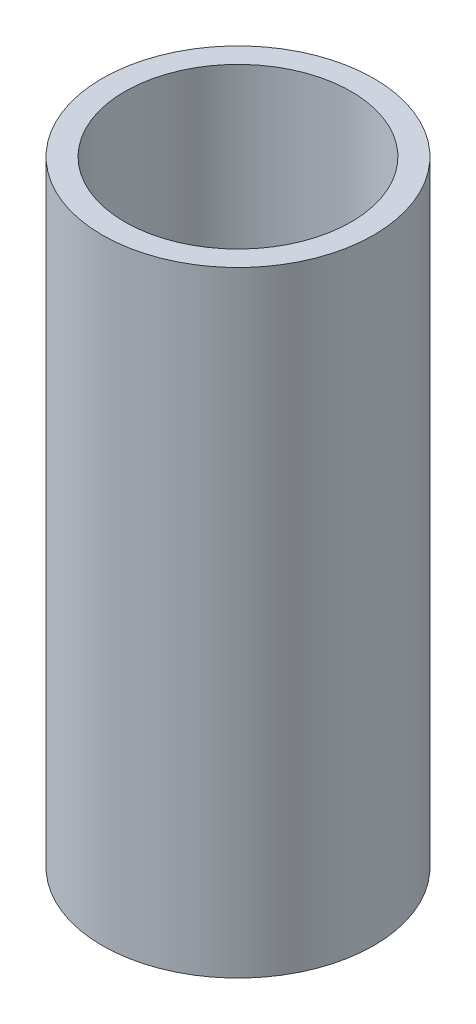
ISO-10303-21;
HEADER;
FILE_DESCRIPTION(('STEP AP214'),'2;1');
FILE_NAME('part.step','',(''),(''),'','','');
FILE_SCHEMA(('AUTOMOTIVE_DESIGN { 1 0 10303 214 1 1 1 1 }'));
ENDSEC;
DATA;
#1=APPLICATION_CONTEXT('core data for automotive mechanical design processes');
#2=APPLICATION_PROTOCOL_DEFINITION('international standard','automotive_design',2000,#1);
#3=PRODUCT_CONTEXT('',#1,'mechanical');
#4=PRODUCT('Part','Part','',(#3));
#5=PRODUCT_RELATED_PRODUCT_CATEGORY('part','',(#4));
#6=PRODUCT_DEFINITION_FORMATION('','',#4);
#7=PRODUCT_DEFINITION_CONTEXT('part definition',#1,'design');
#8=PRODUCT_DEFINITION('design','',#6,#7);
#9=PRODUCT_DEFINITION_SHAPE('','',#8);
#10=(LENGTH_UNIT() NAMED_UNIT(*) SI_UNIT(.MILLI.,.METRE.));
#11=(NAMED_UNIT(*) PLANE_ANGLE_UNIT() SI_UNIT($,.RADIAN.));
#12=(NAMED_UNIT(*) SI_UNIT($,.STERADIAN.) SOLID_ANGLE_UNIT());
#13=UNCERTAINTY_MEASURE_WITH_UNIT(LENGTH_MEASURE(1.E-05),#10,'distance_accuracy_value','');
#14=(GEOMETRIC_REPRESENTATION_CONTEXT(3) GLOBAL_UNCERTAINTY_ASSIGNED_CONTEXT((#13)) GLOBAL_UNIT_ASSIGNED_CONTEXT((#10,
#11,#12)) REPRESENTATION_CONTEXT('',''));
#15=CARTESIAN_POINT('',(0.,0.,0.));
#16=DIRECTION('',(0.,0.,1.));
#17=DIRECTION('',(1.,0.,0.));
#18=AXIS2_PLACEMENT_3D('',#15,#16,#17);
#19=CARTESIAN_POINT('',(0.,43.18,-2.27890666997155));
#20=DIRECTION('',(0.,1.,0.));
#21=DIRECTION('',(0.,0.,1.));
#22=AXIS2_PLACEMENT_3D('',#19,#20,#21);
#23=PLANE('',#22);
#24=CARTESIAN_POINT('',(0.,43.18,-2.27890666997155));
#25=DIRECTION('',(0.,1.,0.));
#26=DIRECTION('',(0.,0.,1.));
#27=AXIS2_PLACEMENT_3D('',#24,#25,#26);
#28=CIRCLE('',#27,9.525);
#29=CARTESIAN_POINT('',(0.,43.18,7.24609333002845));
#30=VERTEX_POINT('',#29);
#31=EDGE_CURVE('E10',#30,#30,#28,.T.);
#32=ORIENTED_EDGE('',*,*,#31,.T.);
#33=EDGE_LOOP('',(#32));
#34=FACE_BOUND('',#33,.T.);
#35=CARTESIAN_POINT('',(0.,43.18,-2.27890666997155));
#36=DIRECTION('',(0.,1.,0.));
#37=DIRECTION('',(0.,0.,1.));
#38=AXIS2_PLACEMENT_3D('',#35,#36,#37);
#39=CIRCLE('',#38,7.9375);
#40=CARTESIAN_POINT('',(0.,43.18,5.65859333002845));
#41=VERTEX_POINT('',#40);
#42=EDGE_CURVE('E41',#41,#41,#39,.T.);
#43=ORIENTED_EDGE('',*,*,#42,.F.);
#44=EDGE_LOOP('',(#43));
#45=FACE_BOUND('',#44,.T.);
#46=ADVANCED_FACE('F30',(#34,#45),#23,.T.);
#47=CARTESIAN_POINT('',(0.,0.,-2.27890666997155));
#48=DIRECTION('',(0.,1.,0.));
#49=DIRECTION('',(0.,0.,1.));
#50=AXIS2_PLACEMENT_3D('',#47,#48,#49);
#51=PLANE('',#50);
#52=CARTESIAN_POINT('',(0.,0.,-2.27890666997155));
#53=DIRECTION('',(0.,1.,0.));
#54=DIRECTION('',(0.,0.,1.));
#55=AXIS2_PLACEMENT_3D('',#52,#53,#54);
#56=CIRCLE('',#55,9.525);
#57=CARTESIAN_POINT('',(0.,0.,7.24609333002845));
#58=VERTEX_POINT('',#57);
#59=EDGE_CURVE('E34',#58,#58,#56,.T.);
#60=ORIENTED_EDGE('',*,*,#59,.F.);
#61=EDGE_LOOP('',(#60));
#62=FACE_BOUND('',#61,.T.);
#63=CARTESIAN_POINT('',(0.,0.,-2.27890666997155));
#64=DIRECTION('',(0.,1.,0.));
#65=DIRECTION('',(0.,0.,1.));
#66=AXIS2_PLACEMENT_3D('',#63,#64,#65);
#67=CIRCLE('',#66,7.9375);
#68=CARTESIAN_POINT('',(0.,0.,5.65859333002845));
#69=VERTEX_POINT('',#68);
#70=EDGE_CURVE('E43',#69,#69,#67,.T.);
#71=ORIENTED_EDGE('',*,*,#70,.T.);
#72=EDGE_LOOP('',(#71));
#73=FACE_BOUND('',#72,.T.);
#74=ADVANCED_FACE('F53',(#62,#73),#51,.F.);
#75=CARTESIAN_POINT('',(0.,43.18,-2.27890666997155));
#76=DIRECTION('',(0.,-1.,0.));
#77=DIRECTION('',(0.,0.,-1.));
#78=AXIS2_PLACEMENT_3D('',#75,#76,#77);
#79=CYLINDRICAL_SURFACE('',#78,9.525);
#80=ORIENTED_EDGE('',*,*,#31,.F.);
#81=EDGE_LOOP('',(#80));
#82=FACE_BOUND('',#81,.T.);
#83=ORIENTED_EDGE('',*,*,#59,.T.);
#84=EDGE_LOOP('',(#83));
#85=FACE_BOUND('',#84,.T.);
#86=ADVANCED_FACE('F32',(#82,#85),#79,.T.);
#87=CARTESIAN_POINT('',(0.,43.18,-2.27890666997155));
#88=DIRECTION('',(0.,-1.,0.));
#89=DIRECTION('',(0.,0.,-1.));
#90=AXIS2_PLACEMENT_3D('',#87,#88,#89);
#91=CYLINDRICAL_SURFACE('',#90,7.9375);
#92=ORIENTED_EDGE('',*,*,#42,.T.);
#93=EDGE_LOOP('',(#92));
#94=FACE_BOUND('',#93,.T.);
#95=ORIENTED_EDGE('',*,*,#70,.F.);
#96=EDGE_LOOP('',(#95));
#97=FACE_BOUND('',#96,.T.);
#98=ADVANCED_FACE('F49',(#94,#97),#91,.F.);
#99=CLOSED_SHELL('',(#46,#74,#86,#98));
#100=MANIFOLD_SOLID_BREP('B2',#99);
#101=ADVANCED_BREP_SHAPE_REPRESENTATION('',(#18,#100),#14);
#102=SHAPE_DEFINITION_REPRESENTATION(#9,#101);
ENDSEC;
END-ISO-10303-21;
